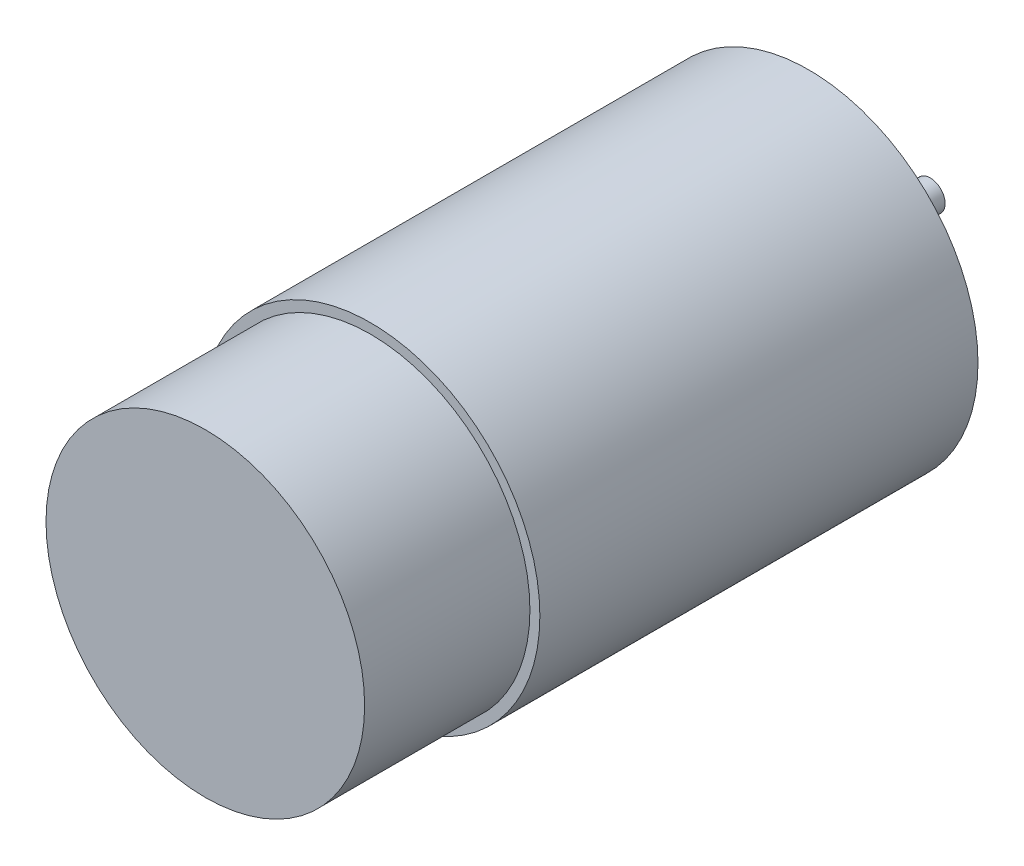
ISO-10303-21;
HEADER;
FILE_DESCRIPTION(('STEP AP214'),'2;1');
FILE_NAME('part.step','',(''),(''),'','','');
FILE_SCHEMA(('AUTOMOTIVE_DESIGN { 1 0 10303 214 1 1 1 1 }'));
ENDSEC;
DATA;
#1=APPLICATION_CONTEXT('core data for automotive mechanical design processes');
#2=APPLICATION_PROTOCOL_DEFINITION('international standard','automotive_design',2000,#1);
#3=PRODUCT_CONTEXT('',#1,'mechanical');
#4=PRODUCT('Part','Part','',(#3));
#5=PRODUCT_RELATED_PRODUCT_CATEGORY('part','',(#4));
#6=PRODUCT_DEFINITION_FORMATION('','',#4);
#7=PRODUCT_DEFINITION_CONTEXT('part definition',#1,'design');
#8=PRODUCT_DEFINITION('design','',#6,#7);
#9=PRODUCT_DEFINITION_SHAPE('','',#8);
#10=(LENGTH_UNIT() NAMED_UNIT(*) SI_UNIT(.MILLI.,.METRE.));
#11=(NAMED_UNIT(*) PLANE_ANGLE_UNIT() SI_UNIT($,.RADIAN.));
#12=(NAMED_UNIT(*) SI_UNIT($,.STERADIAN.) SOLID_ANGLE_UNIT());
#13=UNCERTAINTY_MEASURE_WITH_UNIT(LENGTH_MEASURE(1.E-05),#10,'distance_accuracy_value','');
#14=(GEOMETRIC_REPRESENTATION_CONTEXT(3) GLOBAL_UNCERTAINTY_ASSIGNED_CONTEXT((#13)) GLOBAL_UNIT_ASSIGNED_CONTEXT((#10,
#11,#12)) REPRESENTATION_CONTEXT('',''));
#15=CARTESIAN_POINT('',(0.,0.,0.));
#16=DIRECTION('',(0.,0.,1.));
#17=DIRECTION('',(1.,0.,0.));
#18=AXIS2_PLACEMENT_3D('',#15,#16,#17);
#19=CARTESIAN_POINT('',(0.,0.,-1.));
#20=DIRECTION('',(0.,0.,-1.));
#21=DIRECTION('',(-1.,0.,0.));
#22=AXIS2_PLACEMENT_3D('',#19,#20,#21);
#23=PLANE('',#22);
#24=CARTESIAN_POINT('',(0.,0.,-1.));
#25=DIRECTION('',(0.,0.,-1.));
#26=DIRECTION('',(-1.,0.,0.));
#27=AXIS2_PLACEMENT_3D('',#24,#25,#26);
#28=CIRCLE('',#27,3.);
#29=CARTESIAN_POINT('',(-3.,0.,-1.));
#30=VERTEX_POINT('',#29);
#31=EDGE_CURVE('E51',#30,#30,#28,.T.);
#32=ORIENTED_EDGE('',*,*,#31,.T.);
#33=EDGE_LOOP('',(#32));
#34=FACE_BOUND('',#33,.T.);
#35=CARTESIAN_POINT('',(0.,0.,-1.));
#36=DIRECTION('',(0.,0.,-1.));
#37=DIRECTION('',(-1.,0.,0.));
#38=AXIS2_PLACEMENT_3D('',#35,#36,#37);
#39=CIRCLE('',#38,0.75);
#40=CARTESIAN_POINT('',(-0.75,0.,-1.));
#41=VERTEX_POINT('',#40);
#42=EDGE_CURVE('E57',#41,#41,#39,.T.);
#43=ORIENTED_EDGE('',*,*,#42,.F.);
#44=EDGE_LOOP('',(#43));
#45=FACE_BOUND('',#44,.T.);
#46=ADVANCED_FACE('F28',(#34,#45),#23,.T.);
#47=CARTESIAN_POINT('',(0.,0.,0.));
#48=DIRECTION('',(0.,0.,1.));
#49=DIRECTION('',(1.,0.,0.));
#50=AXIS2_PLACEMENT_3D('',#47,#48,#49);
#51=PLANE('',#50);
#52=CARTESIAN_POINT('',(0.,0.,0.));
#53=DIRECTION('',(0.,0.,1.));
#54=DIRECTION('',(1.,0.,0.));
#55=AXIS2_PLACEMENT_3D('',#52,#53,#54);
#56=CIRCLE('',#55,8.5);
#57=CARTESIAN_POINT('',(8.5,0.,0.));
#58=VERTEX_POINT('',#57);
#59=EDGE_CURVE('E39',#58,#58,#56,.T.);
#60=ORIENTED_EDGE('',*,*,#59,.F.);
#61=EDGE_LOOP('',(#60));
#62=FACE_BOUND('',#61,.T.);
#63=CARTESIAN_POINT('',(0.,0.,0.));
#64=DIRECTION('',(0.,0.,1.));
#65=DIRECTION('',(1.,0.,0.));
#66=AXIS2_PLACEMENT_3D('',#63,#64,#65);
#67=CIRCLE('',#66,3.);
#68=CARTESIAN_POINT('',(3.,0.,0.));
#69=VERTEX_POINT('',#68);
#70=EDGE_CURVE('E10',#69,#69,#67,.F.);
#71=ORIENTED_EDGE('',*,*,#70,.F.);
#72=EDGE_LOOP('',(#71));
#73=FACE_BOUND('',#72,.T.);
#74=ADVANCED_FACE('F64',(#62,#73),#51,.F.);
#75=CARTESIAN_POINT('',(0.,0.,22.));
#76=DIRECTION('',(0.,0.,1.));
#77=DIRECTION('',(1.,0.,0.));
#78=AXIS2_PLACEMENT_3D('',#75,#76,#77);
#79=PLANE('',#78);
#80=CARTESIAN_POINT('',(0.,0.,22.));
#81=DIRECTION('',(0.,0.,1.));
#82=DIRECTION('',(1.,0.,0.));
#83=AXIS2_PLACEMENT_3D('',#80,#81,#82);
#84=CIRCLE('',#83,8.5);
#85=CARTESIAN_POINT('',(8.5,0.,22.));
#86=VERTEX_POINT('',#85);
#87=EDGE_CURVE('E35',#86,#86,#84,.T.);
#88=ORIENTED_EDGE('',*,*,#87,.T.);
#89=EDGE_LOOP('',(#88));
#90=FACE_BOUND('',#89,.T.);
#91=CARTESIAN_POINT('',(0.,0.,22.));
#92=DIRECTION('',(0.,0.,1.));
#93=DIRECTION('',(1.,0.,0.));
#94=AXIS2_PLACEMENT_3D('',#91,#92,#93);
#95=CIRCLE('',#94,8.);
#96=CARTESIAN_POINT('',(-8.,0.,22.));
#97=VERTEX_POINT('',#96);
#98=EDGE_CURVE('E48',#97,#97,#95,.T.);
#99=ORIENTED_EDGE('',*,*,#98,.F.);
#100=EDGE_LOOP('',(#99));
#101=FACE_BOUND('',#100,.T.);
#102=ADVANCED_FACE('F70',(#90,#101),#79,.T.);
#103=CARTESIAN_POINT('',(0.,0.,22.));
#104=DIRECTION('',(0.,0.,-1.));
#105=DIRECTION('',(-1.,0.,0.));
#106=AXIS2_PLACEMENT_3D('',#103,#104,#105);
#107=CYLINDRICAL_SURFACE('',#106,8.5);
#108=ORIENTED_EDGE('',*,*,#87,.F.);
#109=EDGE_LOOP('',(#108));
#110=FACE_BOUND('',#109,.T.);
#111=ORIENTED_EDGE('',*,*,#59,.T.);
#112=EDGE_LOOP('',(#111));
#113=FACE_BOUND('',#112,.T.);
#114=ADVANCED_FACE('F30',(#110,#113),#107,.T.);
#115=CARTESIAN_POINT('',(0.,0.,30.3));
#116=DIRECTION('',(0.,0.,-1.));
#117=DIRECTION('',(-1.,0.,0.));
#118=AXIS2_PLACEMENT_3D('',#115,#116,#117);
#119=CYLINDRICAL_SURFACE('',#118,8.);
#120=CARTESIAN_POINT('',(0.,0.,30.3));
#121=DIRECTION('',(0.,0.,1.));
#122=DIRECTION('',(1.,0.,0.));
#123=AXIS2_PLACEMENT_3D('',#120,#121,#122);
#124=CIRCLE('',#123,8.);
#125=CARTESIAN_POINT('',(-8.,0.,30.3));
#126=VERTEX_POINT('',#125);
#127=EDGE_CURVE('E43',#126,#126,#124,.T.);
#128=CARTESIAN_POINT('',(-8.,0.,30.3));
#129=CARTESIAN_POINT('',(-8.,0.,30.2135416666667));
#130=CARTESIAN_POINT('',(-8.,0.,30.1270833333333));
#131=CARTESIAN_POINT('',(-8.,0.,29.9541666666667));
#132=CARTESIAN_POINT('',(-8.,0.,29.8677083333333));
#133=CARTESIAN_POINT('',(-8.,0.,29.6947916666667));
#134=CARTESIAN_POINT('',(-8.,0.,29.6083333333333));
#135=CARTESIAN_POINT('',(-8.,0.,29.4354166666667));
#136=CARTESIAN_POINT('',(-8.,0.,29.3489583333333));
#137=CARTESIAN_POINT('',(-8.,0.,29.1760416666667));
#138=CARTESIAN_POINT('',(-8.,0.,29.0895833333333));
#139=CARTESIAN_POINT('',(-8.,0.,28.9166666666667));
#140=CARTESIAN_POINT('',(-8.,0.,28.8302083333333));
#141=CARTESIAN_POINT('',(-8.,0.,28.6572916666667));
#142=CARTESIAN_POINT('',(-8.,0.,28.5708333333333));
#143=CARTESIAN_POINT('',(-8.,0.,28.3979166666667));
#144=CARTESIAN_POINT('',(-8.,0.,28.3114583333333));
#145=CARTESIAN_POINT('',(-8.,0.,28.1385416666667));
#146=CARTESIAN_POINT('',(-8.,0.,28.0520833333333));
#147=CARTESIAN_POINT('',(-8.,0.,27.8791666666667));
#148=CARTESIAN_POINT('',(-8.,0.,27.7927083333333));
#149=CARTESIAN_POINT('',(-8.,0.,27.6197916666667));
#150=CARTESIAN_POINT('',(-8.,0.,27.5333333333333));
#151=CARTESIAN_POINT('',(-8.,0.,27.3604166666667));
#152=CARTESIAN_POINT('',(-8.,0.,27.2739583333333));
#153=CARTESIAN_POINT('',(-8.,0.,27.1010416666667));
#154=CARTESIAN_POINT('',(-8.,0.,27.0145833333333));
#155=CARTESIAN_POINT('',(-8.,0.,26.8416666666667));
#156=CARTESIAN_POINT('',(-8.,0.,26.7552083333333));
#157=CARTESIAN_POINT('',(-8.,0.,26.5822916666667));
#158=CARTESIAN_POINT('',(-8.,0.,26.4958333333333));
#159=CARTESIAN_POINT('',(-8.,0.,26.3229166666667));
#160=CARTESIAN_POINT('',(-8.,0.,26.2364583333333));
#161=CARTESIAN_POINT('',(-8.,0.,26.0635416666667));
#162=CARTESIAN_POINT('',(-8.,0.,25.9770833333333));
#163=CARTESIAN_POINT('',(-8.,0.,25.8041666666667));
#164=CARTESIAN_POINT('',(-8.,0.,25.7177083333333));
#165=CARTESIAN_POINT('',(-8.,0.,25.5447916666667));
#166=CARTESIAN_POINT('',(-8.,0.,25.4583333333333));
#167=CARTESIAN_POINT('',(-8.,0.,25.2854166666667));
#168=CARTESIAN_POINT('',(-8.,0.,25.1989583333333));
#169=CARTESIAN_POINT('',(-8.,0.,25.0260416666667));
#170=CARTESIAN_POINT('',(-8.,0.,24.9395833333333));
#171=CARTESIAN_POINT('',(-8.,0.,24.7666666666667));
#172=CARTESIAN_POINT('',(-8.,0.,24.6802083333333));
#173=CARTESIAN_POINT('',(-8.,0.,24.5072916666667));
#174=CARTESIAN_POINT('',(-8.,0.,24.4208333333333));
#175=CARTESIAN_POINT('',(-8.,0.,24.2479166666667));
#176=CARTESIAN_POINT('',(-8.,0.,24.1614583333333));
#177=CARTESIAN_POINT('',(-8.,0.,23.9885416666667));
#178=CARTESIAN_POINT('',(-8.,0.,23.9020833333333));
#179=CARTESIAN_POINT('',(-8.,0.,23.7291666666667));
#180=CARTESIAN_POINT('',(-8.,0.,23.6427083333333));
#181=CARTESIAN_POINT('',(-8.,0.,23.4697916666667));
#182=CARTESIAN_POINT('',(-8.,0.,23.3833333333333));
#183=CARTESIAN_POINT('',(-8.,0.,23.2104166666667));
#184=CARTESIAN_POINT('',(-8.,0.,23.1239583333333));
#185=CARTESIAN_POINT('',(-8.,0.,22.9510416666667));
#186=CARTESIAN_POINT('',(-8.,0.,22.8645833333333));
#187=CARTESIAN_POINT('',(-8.,0.,22.6916666666667));
#188=CARTESIAN_POINT('',(-8.,0.,22.6052083333333));
#189=CARTESIAN_POINT('',(-8.,0.,22.4322916666667));
#190=CARTESIAN_POINT('',(-8.,0.,22.3458333333333));
#191=CARTESIAN_POINT('',(-8.,0.,22.1729166666667));
#192=CARTESIAN_POINT('',(-8.,0.,22.0864583333333));
#193=CARTESIAN_POINT('',(-8.,0.,22.));
#194=B_SPLINE_CURVE_WITH_KNOTS('',3,(#128,#129,#130,#131,#132,#133,#134,#135,#136,#137,#138,
#139,#140,#141,#142,#143,#144,#145,#146,#147,#148,#149,#150,#151,#152,#153,#154,#155,#156,#157,
#158,#159,#160,#161,#162,#163,#164,#165,#166,#167,#168,#169,#170,#171,#172,#173,#174,#175,#176,
#177,#178,#179,#180,#181,#182,#183,#184,#185,#186,#187,#188,#189,#190,#191,#192,#193),
.UNSPECIFIED.,.F.,.F.,(4,2,2,2,2,2,2,2,2,2,2,2,2,2,2,2,2,2,2,2,2,2,2,2,2,2,2,2,2,2,2,2,4),(0.,
0.259374999999999,0.518749999999998,0.778124999999998,1.0375,1.296875,1.55625,1.815625,2.075,
2.334375,2.59375,2.853125,3.1125,3.371875,3.63125,3.890625,4.15,4.409375,4.66875,4.928125,
5.1875,5.446875,5.70625,5.965625,6.225,6.484375,6.74375,7.003125,7.2625,7.521875,7.78125,
8.040625,8.3),.UNSPECIFIED.);
#195=EDGE_CURVE('BSEAM83',#126,#97,#194,.T.);
#196=ORIENTED_EDGE('',*,*,#127,.F.);
#197=ORIENTED_EDGE('',*,*,#98,.T.);
#198=ORIENTED_EDGE('',*,*,#195,.T.);
#199=ORIENTED_EDGE('',*,*,#195,.F.);
#200=EDGE_LOOP('',(#196,#198,#197,#199));
#201=FACE_BOUND('',#200,.T.);
#202=ADVANCED_FACE('F83',(#201),#119,.T.);
#203=CARTESIAN_POINT('',(0.,0.,30.3));
#204=DIRECTION('',(0.,0.,1.));
#205=DIRECTION('',(1.,0.,0.));
#206=AXIS2_PLACEMENT_3D('',#203,#204,#205);
#207=PLANE('',#206);
#208=ORIENTED_EDGE('',*,*,#127,.T.);
#209=EDGE_LOOP('',(#208));
#210=FACE_BOUND('',#209,.T.);
#211=ADVANCED_FACE('F79',(#210),#207,.T.);
#212=CARTESIAN_POINT('',(0.,0.,-1.));
#213=DIRECTION('',(0.,0.,1.));
#214=DIRECTION('',(1.,0.,0.));
#215=AXIS2_PLACEMENT_3D('',#212,#213,#214);
#216=CYLINDRICAL_SURFACE('',#215,3.);
#217=ORIENTED_EDGE('',*,*,#31,.F.);
#218=EDGE_LOOP('',(#217));
#219=FACE_BOUND('',#218,.T.);
#220=ORIENTED_EDGE('',*,*,#70,.T.);
#221=EDGE_LOOP('',(#220));
#222=FACE_BOUND('',#221,.T.);
#223=ADVANCED_FACE('F76',(#219,#222),#216,.T.);
#224=CARTESIAN_POINT('',(0.,0.,-6.1));
#225=DIRECTION('',(0.,0.,1.));
#226=DIRECTION('',(1.,0.,0.));
#227=AXIS2_PLACEMENT_3D('',#224,#225,#226);
#228=CYLINDRICAL_SURFACE('',#227,0.75);
#229=CARTESIAN_POINT('',(0.,0.,-6.1));
#230=DIRECTION('',(0.,0.,-1.));
#231=DIRECTION('',(-1.,0.,0.));
#232=AXIS2_PLACEMENT_3D('',#229,#230,#231);
#233=CIRCLE('',#232,0.75);
#234=CARTESIAN_POINT('',(-0.75,0.,-6.1));
#235=VERTEX_POINT('',#234);
#236=EDGE_CURVE('E54',#235,#235,#233,.T.);
#237=ORIENTED_EDGE('',*,*,#236,.F.);
#238=EDGE_LOOP('',(#237));
#239=FACE_BOUND('',#238,.T.);
#240=ORIENTED_EDGE('',*,*,#42,.T.);
#241=EDGE_LOOP('',(#240));
#242=FACE_BOUND('',#241,.T.);
#243=ADVANCED_FACE('F61',(#239,#242),#228,.T.);
#244=CARTESIAN_POINT('',(0.,0.,-6.1));
#245=DIRECTION('',(0.,0.,-1.));
#246=DIRECTION('',(-1.,0.,0.));
#247=AXIS2_PLACEMENT_3D('',#244,#245,#246);
#248=PLANE('',#247);
#249=ORIENTED_EDGE('',*,*,#236,.T.);
#250=EDGE_LOOP('',(#249));
#251=FACE_BOUND('',#250,.T.);
#252=ADVANCED_FACE('F119',(#251),#248,.T.);
#253=CLOSED_SHELL('',(#46,#74,#102,#114,#202,#211,#223,#243,#252));
#254=MANIFOLD_SOLID_BREP('B2',#253);
#255=ADVANCED_BREP_SHAPE_REPRESENTATION('',(#18,#254),#14);
#256=SHAPE_DEFINITION_REPRESENTATION(#9,#255);
ENDSEC;
END-ISO-10303-21;
